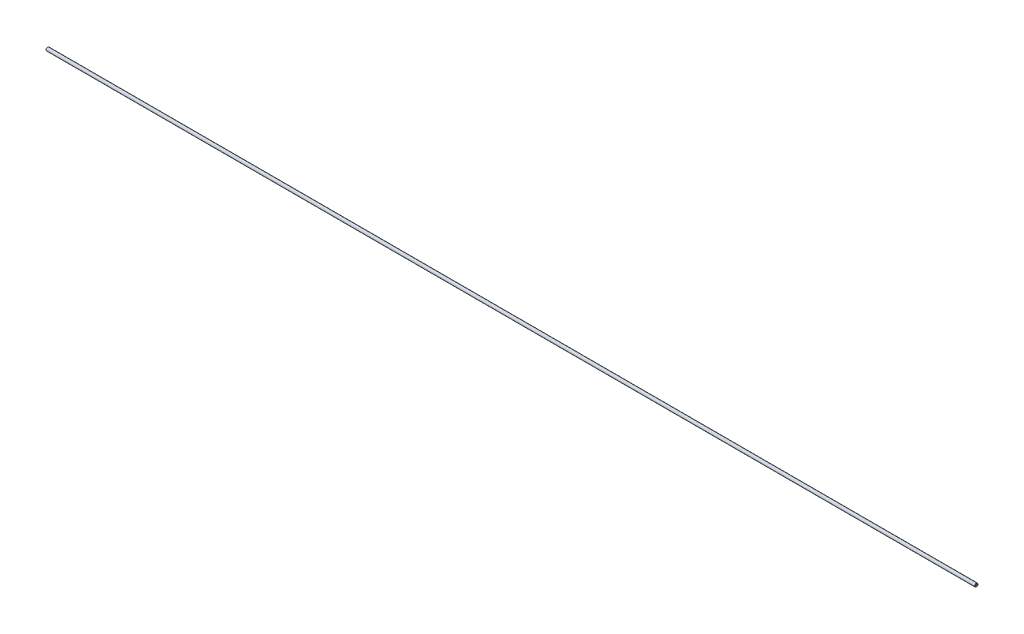
ISO-10303-21;
HEADER;
FILE_DESCRIPTION(('STEP AP214'),'2;1');
FILE_NAME('part.step','',(''),(''),'','','');
FILE_SCHEMA(('AUTOMOTIVE_DESIGN { 1 0 10303 214 1 1 1 1 }'));
ENDSEC;
DATA;
#1=APPLICATION_CONTEXT('core data for automotive mechanical design processes');
#2=APPLICATION_PROTOCOL_DEFINITION('international standard','automotive_design',2000,#1);
#3=PRODUCT_CONTEXT('',#1,'mechanical');
#4=PRODUCT('Part','Part','',(#3));
#5=PRODUCT_RELATED_PRODUCT_CATEGORY('part','',(#4));
#6=PRODUCT_DEFINITION_FORMATION('','',#4);
#7=PRODUCT_DEFINITION_CONTEXT('part definition',#1,'design');
#8=PRODUCT_DEFINITION('design','',#6,#7);
#9=PRODUCT_DEFINITION_SHAPE('','',#8);
#10=(LENGTH_UNIT() NAMED_UNIT(*) SI_UNIT(.MILLI.,.METRE.));
#11=(NAMED_UNIT(*) PLANE_ANGLE_UNIT() SI_UNIT($,.RADIAN.));
#12=(NAMED_UNIT(*) SI_UNIT($,.STERADIAN.) SOLID_ANGLE_UNIT());
#13=UNCERTAINTY_MEASURE_WITH_UNIT(LENGTH_MEASURE(1.E-05),#10,'distance_accuracy_value','');
#14=(GEOMETRIC_REPRESENTATION_CONTEXT(3) GLOBAL_UNCERTAINTY_ASSIGNED_CONTEXT((#13)) GLOBAL_UNIT_ASSIGNED_CONTEXT((#10,
#11,#12)) REPRESENTATION_CONTEXT('',''));
#15=CARTESIAN_POINT('',(0.,0.,0.));
#16=DIRECTION('',(0.,0.,1.));
#17=DIRECTION('',(1.,0.,0.));
#18=AXIS2_PLACEMENT_3D('',#15,#16,#17);
#19=CARTESIAN_POINT('',(14373.606,0.,0.));
#20=DIRECTION('',(-1.,0.,0.));
#21=DIRECTION('',(0.,0.,1.));
#22=AXIS2_PLACEMENT_3D('',#19,#20,#21);
#23=CYLINDRICAL_SURFACE('',#22,25.4);
#24=CARTESIAN_POINT('',(14373.606,0.,0.));
#25=DIRECTION('',(1.,0.,0.));
#26=DIRECTION('',(0.,0.,-1.));
#27=AXIS2_PLACEMENT_3D('',#24,#25,#26);
#28=CIRCLE('',#27,25.4);
#29=CARTESIAN_POINT('',(14373.606,0.,-25.4));
#30=VERTEX_POINT('',#29);
#31=EDGE_CURVE('E10',#30,#30,#28,.T.);
#32=ORIENTED_EDGE('',*,*,#31,.F.);
#33=EDGE_LOOP('',(#32));
#34=FACE_BOUND('',#33,.T.);
#35=CARTESIAN_POINT('',(0.,0.,0.));
#36=DIRECTION('',(1.,0.,0.));
#37=DIRECTION('',(0.,0.,-1.));
#38=AXIS2_PLACEMENT_3D('',#35,#36,#37);
#39=CIRCLE('',#38,25.4);
#40=CARTESIAN_POINT('',(0.,0.,-25.4));
#41=VERTEX_POINT('',#40);
#42=EDGE_CURVE('E48',#41,#41,#39,.T.);
#43=ORIENTED_EDGE('',*,*,#42,.T.);
#44=EDGE_LOOP('',(#43));
#45=FACE_BOUND('',#44,.T.);
#46=ADVANCED_FACE('F44',(#34,#45),#23,.T.);
#47=CARTESIAN_POINT('',(14373.606,0.,0.));
#48=DIRECTION('',(1.,0.,0.));
#49=DIRECTION('',(0.,0.,-1.));
#50=AXIS2_PLACEMENT_3D('',#47,#48,#49);
#51=PLANE('',#50);
#52=CARTESIAN_POINT('',(14373.606,0.,0.));
#53=DIRECTION('',(1.,0.,0.));
#54=DIRECTION('',(0.,0.,-1.));
#55=AXIS2_PLACEMENT_3D('',#52,#53,#54);
#56=CIRCLE('',#55,12.7);
#57=CARTESIAN_POINT('',(14373.606,0.,-12.7));
#58=VERTEX_POINT('',#57);
#59=EDGE_CURVE('E60',#58,#58,#56,.T.);
#60=ORIENTED_EDGE('',*,*,#59,.F.);
#61=EDGE_LOOP('',(#60));
#62=FACE_BOUND('',#61,.T.);
#63=ORIENTED_EDGE('',*,*,#31,.T.);
#64=EDGE_LOOP('',(#63));
#65=FACE_BOUND('',#64,.T.);
#66=ADVANCED_FACE('F75',(#62,#65),#51,.T.);
#67=CARTESIAN_POINT('',(0.,0.,0.));
#68=DIRECTION('',(1.,0.,0.));
#69=DIRECTION('',(0.,0.,-1.));
#70=AXIS2_PLACEMENT_3D('',#67,#68,#69);
#71=PLANE('',#70);
#72=CARTESIAN_POINT('',(0.,0.,0.));
#73=DIRECTION('',(1.,0.,0.));
#74=DIRECTION('',(0.,0.,-1.));
#75=AXIS2_PLACEMENT_3D('',#72,#73,#74);
#76=CIRCLE('',#75,12.7);
#77=CARTESIAN_POINT('',(0.,0.,-12.7));
#78=VERTEX_POINT('',#77);
#79=EDGE_CURVE('E54',#78,#78,#76,.T.);
#80=ORIENTED_EDGE('',*,*,#79,.T.);
#81=EDGE_LOOP('',(#80));
#82=FACE_BOUND('',#81,.T.);
#83=ORIENTED_EDGE('',*,*,#42,.F.);
#84=EDGE_LOOP('',(#83));
#85=FACE_BOUND('',#84,.T.);
#86=ADVANCED_FACE('F62',(#82,#85),#71,.F.);
#87=CARTESIAN_POINT('',(0.,0.,0.));
#88=DIRECTION('',(1.,0.,0.));
#89=DIRECTION('',(0.,0.,-1.));
#90=AXIS2_PLACEMENT_3D('',#87,#88,#89);
#91=CYLINDRICAL_SURFACE('',#90,12.7);
#92=ORIENTED_EDGE('',*,*,#79,.F.);
#93=EDGE_LOOP('',(#92));
#94=FACE_BOUND('',#93,.T.);
#95=ORIENTED_EDGE('',*,*,#59,.T.);
#96=EDGE_LOOP('',(#95));
#97=FACE_BOUND('',#96,.T.);
#98=ADVANCED_FACE('F69',(#94,#97),#91,.F.);
#99=CLOSED_SHELL('',(#46,#66,#86,#98));
#100=MANIFOLD_SOLID_BREP('B2',#99);
#101=ADVANCED_BREP_SHAPE_REPRESENTATION('',(#18,#100),#14);
#102=SHAPE_DEFINITION_REPRESENTATION(#9,#101);
ENDSEC;
END-ISO-10303-21;
